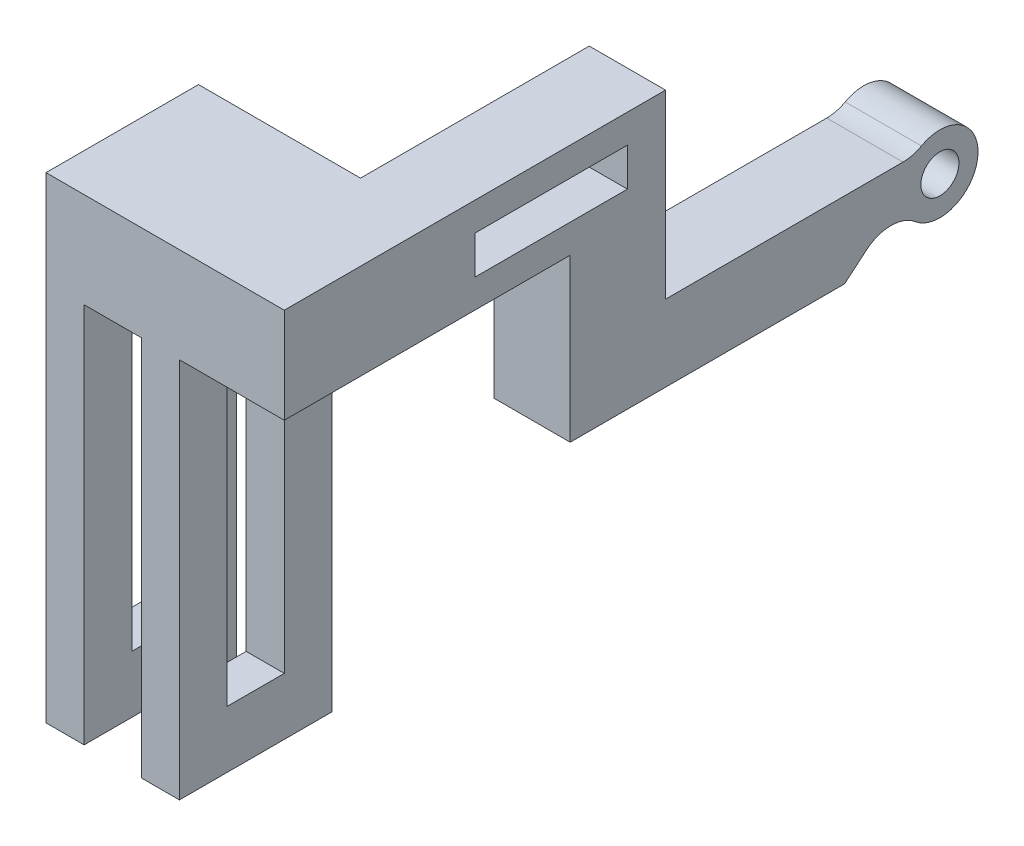
ISO-10303-21;
HEADER;
FILE_DESCRIPTION(('STEP AP214'),'2;1');
FILE_NAME('part.step','',(''),(''),'','','');
FILE_SCHEMA(('AUTOMOTIVE_DESIGN { 1 0 10303 214 1 1 1 1 }'));
ENDSEC;
DATA;
#1=APPLICATION_CONTEXT('core data for automotive mechanical design processes');
#2=APPLICATION_PROTOCOL_DEFINITION('international standard','automotive_design',2000,#1);
#3=PRODUCT_CONTEXT('',#1,'mechanical');
#4=PRODUCT('Part','Part','',(#3));
#5=PRODUCT_RELATED_PRODUCT_CATEGORY('part','',(#4));
#6=PRODUCT_DEFINITION_FORMATION('','',#4);
#7=PRODUCT_DEFINITION_CONTEXT('part definition',#1,'design');
#8=PRODUCT_DEFINITION('design','',#6,#7);
#9=PRODUCT_DEFINITION_SHAPE('','',#8);
#10=(LENGTH_UNIT() NAMED_UNIT(*) SI_UNIT(.MILLI.,.METRE.));
#11=(NAMED_UNIT(*) PLANE_ANGLE_UNIT() SI_UNIT($,.RADIAN.));
#12=(NAMED_UNIT(*) SI_UNIT($,.STERADIAN.) SOLID_ANGLE_UNIT());
#13=UNCERTAINTY_MEASURE_WITH_UNIT(LENGTH_MEASURE(1.E-05),#10,'distance_accuracy_value','');
#14=(GEOMETRIC_REPRESENTATION_CONTEXT(3) GLOBAL_UNCERTAINTY_ASSIGNED_CONTEXT((#13)) GLOBAL_UNIT_ASSIGNED_CONTEXT((#10,
#11,#12)) REPRESENTATION_CONTEXT('',''));
#15=CARTESIAN_POINT('',(0.,0.,0.));
#16=DIRECTION('',(0.,0.,1.));
#17=DIRECTION('',(1.,0.,0.));
#18=AXIS2_PLACEMENT_3D('',#15,#16,#17);
#19=CARTESIAN_POINT('',(22.6155281280883,8.82842712474617,0.));
#20=DIRECTION('',(0.,-1.,0.));
#21=DIRECTION('',(0.,0.,-1.));
#22=AXIS2_PLACEMENT_3D('',#19,#20,#21);
#23=PLANE('',#22);
#24=DIRECTION('',(0.,0.,1.));
#25=VECTOR('',#24,1.);
#26=CARTESIAN_POINT('',(-3.5,8.82842712474617,0.));
#27=LINE('',#26,#25);
#28=CARTESIAN_POINT('',(-3.5,8.82842712474617,29.2212425586298));
#29=VERTEX_POINT('',#28);
#30=CARTESIAN_POINT('',(-3.5,8.82842712474617,31.7212425586298));
#31=VERTEX_POINT('',#30);
#32=EDGE_CURVE('E268',#29,#31,#27,.T.);
#33=ORIENTED_EDGE('',*,*,#32,.F.);
#34=DIRECTION('',(1.,0.,0.));
#35=VECTOR('',#34,1.);
#36=CARTESIAN_POINT('',(-10.5,8.82842712474617,29.2212425586298));
#37=LINE('',#36,#35);
#38=CARTESIAN_POINT('',(-2.,8.82842712474617,29.2212425586298));
#39=VERTEX_POINT('',#38);
#40=EDGE_CURVE('E364',#29,#39,#37,.T.);
#41=ORIENTED_EDGE('',*,*,#40,.T.);
#42=DIRECTION('',(0.,0.,-1.));
#43=VECTOR('',#42,1.);
#44=CARTESIAN_POINT('',(-2.,8.82842712474617,0.));
#45=LINE('',#44,#43);
#46=CARTESIAN_POINT('',(-2.,8.82842712474617,22.2212425586298));
#47=VERTEX_POINT('',#46);
#48=EDGE_CURVE('E370',#39,#47,#45,.T.);
#49=ORIENTED_EDGE('',*,*,#48,.T.);
#50=DIRECTION('',(-1.,0.,0.));
#51=VECTOR('',#50,1.);
#52=CARTESIAN_POINT('',(22.6155281280883,8.82842712474617,22.2212425586298));
#53=LINE('',#52,#51);
#54=CARTESIAN_POINT('',(2.,8.82842712474617,22.2212425586298));
#55=VERTEX_POINT('',#54);
#56=EDGE_CURVE('E373',#55,#47,#53,.T.);
#57=ORIENTED_EDGE('',*,*,#56,.F.);
#58=DIRECTION('',(0.,0.,1.));
#59=VECTOR('',#58,1.);
#60=CARTESIAN_POINT('',(2.,8.82842712474617,0.));
#61=LINE('',#60,#59);
#62=CARTESIAN_POINT('',(2.,8.82842712474617,37.2212425586298));
#63=VERTEX_POINT('',#62);
#64=EDGE_CURVE('E376',#55,#63,#61,.T.);
#65=ORIENTED_EDGE('',*,*,#64,.T.);
#66=DIRECTION('',(-1.,0.,0.));
#67=VECTOR('',#66,1.);
#68=CARTESIAN_POINT('',(22.6155281280883,8.82842712474617,37.2212425586298));
#69=LINE('',#68,#67);
#70=CARTESIAN_POINT('',(-3.5,8.82842712474617,37.2212425586298));
#71=VERTEX_POINT('',#70);
#72=EDGE_CURVE('E386',#63,#71,#69,.T.);
#73=ORIENTED_EDGE('',*,*,#72,.T.);
#74=CARTESIAN_POINT('',(-3.5,8.82842712474617,34.7212425586298));
#75=VERTEX_POINT('',#74);
#76=EDGE_CURVE('E250',#75,#71,#27,.T.);
#77=ORIENTED_EDGE('',*,*,#76,.F.);
#78=DIRECTION('',(-1.,0.,0.));
#79=VECTOR('',#78,1.);
#80=CARTESIAN_POINT('',(-3.5,8.82842712474617,34.7212425586298));
#81=LINE('',#80,#79);
#82=CARTESIAN_POINT('',(-5.5,8.82842712474617,34.7212425586298));
#83=VERTEX_POINT('',#82);
#84=EDGE_CURVE('E262',#75,#83,#81,.T.);
#85=ORIENTED_EDGE('',*,*,#84,.T.);
#86=DIRECTION('',(0.,0.,1.));
#87=VECTOR('',#86,1.);
#88=CARTESIAN_POINT('',(-5.5,8.82842712474617,0.));
#89=LINE('',#88,#87);
#90=CARTESIAN_POINT('',(-5.5,8.82842712474617,37.2212425586298));
#91=VERTEX_POINT('',#90);
#92=EDGE_CURVE('E280',#83,#91,#89,.T.);
#93=ORIENTED_EDGE('',*,*,#92,.T.);
#94=CARTESIAN_POINT('',(-8.5,8.82842712474617,37.2212425586298));
#95=VERTEX_POINT('',#94);
#96=EDGE_CURVE('E379',#91,#95,#69,.T.);
#97=ORIENTED_EDGE('',*,*,#96,.T.);
#98=DIRECTION('',(0.,0.,1.));
#99=VECTOR('',#98,1.);
#100=CARTESIAN_POINT('',(-8.5,8.82842712474617,0.));
#101=LINE('',#100,#99);
#102=CARTESIAN_POINT('',(-8.5,8.82842712474617,34.7212425586298));
#103=VERTEX_POINT('',#102);
#104=EDGE_CURVE('E312',#103,#95,#101,.T.);
#105=ORIENTED_EDGE('',*,*,#104,.F.);
#106=DIRECTION('',(-1.,0.,0.));
#107=VECTOR('',#106,1.);
#108=CARTESIAN_POINT('',(-8.5,8.82842712474617,34.7212425586298));
#109=LINE('',#108,#107);
#110=CARTESIAN_POINT('',(-10.5,8.82842712474617,34.7212425586298));
#111=VERTEX_POINT('',#110);
#112=EDGE_CURVE('E343',#103,#111,#109,.T.);
#113=ORIENTED_EDGE('',*,*,#112,.T.);
#114=DIRECTION('',(0.,0.,1.));
#115=VECTOR('',#114,1.);
#116=CARTESIAN_POINT('',(-10.5,8.82842712474617,0.));
#117=LINE('',#116,#115);
#118=CARTESIAN_POINT('',(-10.5,8.82842712474617,31.7212425586298));
#119=VERTEX_POINT('',#118);
#120=EDGE_CURVE('E357',#119,#111,#117,.T.);
#121=ORIENTED_EDGE('',*,*,#120,.F.);
#122=DIRECTION('',(-1.,0.,0.));
#123=VECTOR('',#122,1.);
#124=CARTESIAN_POINT('',(-8.5,8.82842712474617,31.7212425586298));
#125=LINE('',#124,#123);
#126=CARTESIAN_POINT('',(-8.5,8.82842712474617,31.7212425586298));
#127=VERTEX_POINT('',#126);
#128=EDGE_CURVE('E334',#127,#119,#125,.T.);
#129=ORIENTED_EDGE('',*,*,#128,.F.);
#130=DIRECTION('',(0.,0.,1.));
#131=VECTOR('',#130,1.);
#132=CARTESIAN_POINT('',(-8.5,8.82842712474617,0.));
#133=LINE('',#132,#131);
#134=CARTESIAN_POINT('',(-8.5,8.82842712474617,29.2212425586298));
#135=VERTEX_POINT('',#134);
#136=EDGE_CURVE('E322',#135,#127,#133,.T.);
#137=ORIENTED_EDGE('',*,*,#136,.F.);
#138=CARTESIAN_POINT('',(-5.5,8.82842712474617,29.2212425586298));
#139=VERTEX_POINT('',#138);
#140=EDGE_CURVE('E361',#135,#139,#37,.T.);
#141=ORIENTED_EDGE('',*,*,#140,.T.);
#142=CARTESIAN_POINT('',(-5.5,8.82842712474617,31.7212425586298));
#143=VERTEX_POINT('',#142);
#144=EDGE_CURVE('E59',#139,#143,#89,.T.);
#145=ORIENTED_EDGE('',*,*,#144,.T.);
#146=DIRECTION('',(-1.,0.,0.));
#147=VECTOR('',#146,1.);
#148=CARTESIAN_POINT('',(-3.5,8.82842712474617,31.7212425586298));
#149=LINE('',#148,#147);
#150=EDGE_CURVE('E54',#31,#143,#149,.T.);
#151=ORIENTED_EDGE('',*,*,#150,.F.);
#152=EDGE_LOOP('',(#33,#41,#49,#57,#65,#73,#77,#85,#93,#97,#105,#113,#121,#129,#137,#141,#145,#151));
#153=FACE_BOUND('',#152,.T.);
#154=ADVANCED_FACE('F39',(#153),#23,.T.);
#155=CARTESIAN_POINT('',(-2.,-0.240042021552196,5.39445461840541));
#156=DIRECTION('',(1.,0.,0.));
#157=DIRECTION('',(0.,0.,-1.));
#158=AXIS2_PLACEMENT_3D('',#155,#156,#157);
#159=PLANE('',#158);
#160=DIRECTION('',(0.,0.,1.));
#161=VECTOR('',#160,1.);
#162=CARTESIAN_POINT('',(-2.,12.3284271247462,27.2212425586298));
#163=LINE('',#162,#161);
#164=CARTESIAN_POINT('',(-2.,12.3284271247462,19.2212425586298));
#165=VERTEX_POINT('',#164);
#166=CARTESIAN_POINT('',(-2.,12.3284271247462,27.2212425586298));
#167=VERTEX_POINT('',#166);
#168=EDGE_CURVE('E404',#165,#167,#163,.T.);
#169=ORIENTED_EDGE('',*,*,#168,.T.);
#170=DIRECTION('',(0.,-1.,0.));
#171=VECTOR('',#170,1.);
#172=CARTESIAN_POINT('',(-2.,10.3284271247462,27.2212425586298));
#173=LINE('',#172,#171);
#174=CARTESIAN_POINT('',(-2.,10.3284271247462,27.2212425586298));
#175=VERTEX_POINT('',#174);
#176=EDGE_CURVE('E400',#167,#175,#173,.T.);
#177=ORIENTED_EDGE('',*,*,#176,.T.);
#178=DIRECTION('',(0.,0.,1.));
#179=VECTOR('',#178,1.);
#180=CARTESIAN_POINT('',(-2.,10.3284271247462,27.2212425586298));
#181=LINE('',#180,#179);
#182=CARTESIAN_POINT('',(-2.,10.3284271247462,19.2212425586298));
#183=VERTEX_POINT('',#182);
#184=EDGE_CURVE('E407',#183,#175,#181,.T.);
#185=ORIENTED_EDGE('',*,*,#184,.F.);
#186=DIRECTION('',(0.,-1.,0.));
#187=VECTOR('',#186,1.);
#188=CARTESIAN_POINT('',(-2.,10.3284271247462,19.2212425586298));
#189=LINE('',#188,#187);
#190=EDGE_CURVE('E369',#165,#183,#189,.T.);
#191=ORIENTED_EDGE('',*,*,#190,.F.);
#192=EDGE_LOOP('',(#169,#177,#185,#191));
#193=FACE_BOUND('',#192,.T.);
#194=CARTESIAN_POINT('',(-2.,2.82842712474617,2.82842712474621));
#195=DIRECTION('',(1.,0.,0.));
#196=DIRECTION('',(0.,0.,-1.));
#197=AXIS2_PLACEMENT_3D('',#194,#195,#196);
#198=CIRCLE('',#197,1.);
#199=CARTESIAN_POINT('',(-2.,2.82842712474617,1.82842712474621));
#200=VERTEX_POINT('',#199);
#201=EDGE_CURVE('E455',#200,#200,#198,.T.);
#202=ORIENTED_EDGE('',*,*,#201,.T.);
#203=EDGE_LOOP('',(#202));
#204=FACE_BOUND('',#203,.T.);
#205=DIRECTION('',(0.,-1.,0.));
#206=VECTOR('',#205,1.);
#207=CARTESIAN_POINT('',(-2.,-0.240042021552196,29.2212425586298));
#208=LINE('',#207,#206);
#209=CARTESIAN_POINT('',(-2.00000000000001,13.8284271247462,29.2212425586298));
#210=VERTEX_POINT('',#209);
#211=EDGE_CURVE('E363',#210,#39,#208,.T.);
#212=ORIENTED_EDGE('',*,*,#211,.F.);
#213=DIRECTION('',(0.,0.,-1.));
#214=VECTOR('',#213,1.);
#215=CARTESIAN_POINT('',(-2.,13.8284271247462,0.));
#216=LINE('',#215,#214);
#217=CARTESIAN_POINT('',(-2.,13.8284271247462,17.2212425586298));
#218=VERTEX_POINT('',#217);
#219=EDGE_CURVE('E372',#210,#218,#216,.T.);
#220=ORIENTED_EDGE('',*,*,#219,.T.);
#221=DIRECTION('',(0.,1.,0.));
#222=VECTOR('',#221,1.);
#223=CARTESIAN_POINT('',(-2.,8.82842712474617,17.2212425586298));
#224=LINE('',#223,#222);
#225=CARTESIAN_POINT('',(-2.,4.32842712474617,17.2212425586298));
#226=VERTEX_POINT('',#225);
#227=EDGE_CURVE('E388',#226,#218,#224,.T.);
#228=ORIENTED_EDGE('',*,*,#227,.F.);
#229=DIRECTION('',(0.,0.,1.));
#230=VECTOR('',#229,1.);
#231=CARTESIAN_POINT('',(-2.,4.32842712474617,4.76491879784991));
#232=LINE('',#231,#230);
#233=CARTESIAN_POINT('',(-2.,4.32842712474617,4.76491879784991));
#234=VERTEX_POINT('',#233);
#235=EDGE_CURVE('E472',#234,#226,#232,.T.);
#236=ORIENTED_EDGE('',*,*,#235,.F.);
#237=CARTESIAN_POINT('',(-2.,6.32842712474617,4.76491879784991));
#238=DIRECTION('',(-1.,0.,0.));
#239=DIRECTION('',(0.,0.,-1.));
#240=AXIS2_PLACEMENT_3D('',#237,#238,#239);
#241=CIRCLE('',#240,2.);
#242=CARTESIAN_POINT('',(-2.,4.57842712474617,3.79667296129806));
#243=VERTEX_POINT('',#242);
#244=EDGE_CURVE('E469',#243,#234,#241,.T.);
#245=ORIENTED_EDGE('',*,*,#244,.F.);
#246=CARTESIAN_POINT('',(-2.,2.82842712474617,2.82842712474621));
#247=DIRECTION('',(1.,0.,0.));
#248=DIRECTION('',(0.,0.,-1.));
#249=AXIS2_PLACEMENT_3D('',#246,#247,#248);
#250=CIRCLE('',#249,2.);
#251=CARTESIAN_POINT('',(-2.,1.29419255159699,4.11144087157581));
#252=VERTEX_POINT('',#251);
#253=EDGE_CURVE('E466',#252,#243,#250,.T.);
#254=ORIENTED_EDGE('',*,*,#253,.F.);
#255=CARTESIAN_POINT('',(-2.,-0.240042021552196,5.39445461840541));
#256=DIRECTION('',(-1.,0.,0.));
#257=DIRECTION('',(0.,0.,-1.));
#258=AXIS2_PLACEMENT_3D('',#255,#256,#257);
#259=CIRCLE('',#258,2.);
#260=CARTESIAN_POINT('',(-2.,1.29204686468577,6.68002983777848));
#261=VERTEX_POINT('',#260);
#262=EDGE_CURVE('E463',#261,#252,#259,.T.);
#263=ORIENTED_EDGE('',*,*,#262,.F.);
#264=DIRECTION('',(0.,0.642787609686535,-0.766044443118982));
#265=VECTOR('',#264,1.);
#266=CARTESIAN_POINT('',(-2.,0.328427124746174,7.8284271247462));
#267=LINE('',#266,#265);
#268=CARTESIAN_POINT('',(-2.,0.328427124746174,7.8284271247462));
#269=VERTEX_POINT('',#268);
#270=EDGE_CURVE('E460',#269,#261,#267,.T.);
#271=ORIENTED_EDGE('',*,*,#270,.F.);
#272=DIRECTION('',(0.,0.,-1.));
#273=VECTOR('',#272,1.);
#274=CARTESIAN_POINT('',(-2.,0.328427124746174,7.8284271247462));
#275=LINE('',#274,#273);
#276=CARTESIAN_POINT('',(-2.,0.328427124746172,22.2212425586298));
#277=VERTEX_POINT('',#276);
#278=EDGE_CURVE('E458',#277,#269,#275,.T.);
#279=ORIENTED_EDGE('',*,*,#278,.F.);
#280=DIRECTION('',(0.,-1.,0.));
#281=VECTOR('',#280,1.);
#282=CARTESIAN_POINT('',(-2.,-0.240042021552196,22.2212425586298));
#283=LINE('',#282,#281);
#284=EDGE_CURVE('E433',#47,#277,#283,.T.);
#285=ORIENTED_EDGE('',*,*,#284,.F.);
#286=ORIENTED_EDGE('',*,*,#48,.F.);
#287=EDGE_LOOP('',(#212,#220,#228,#236,#245,#254,#263,#271,#279,#285,#286));
#288=FACE_BOUND('',#287,.T.);
#289=ADVANCED_FACE('F504',(#193,#204,#288),#159,.F.);
#290=CARTESIAN_POINT('',(-2.,4.32842712474617,4.76491879784991));
#291=DIRECTION('',(0.,1.,0.));
#292=DIRECTION('',(0.,0.,1.));
#293=AXIS2_PLACEMENT_3D('',#290,#291,#292);
#294=PLANE('',#293);
#295=DIRECTION('',(-1.,0.,0.));
#296=VECTOR('',#295,1.);
#297=CARTESIAN_POINT('',(22.6155281280883,4.32842712474617,17.2212425586298));
#298=LINE('',#297,#296);
#299=CARTESIAN_POINT('',(2.,4.32842712474617,17.2212425586298));
#300=VERTEX_POINT('',#299);
#301=EDGE_CURVE('E395',#300,#226,#298,.T.);
#302=ORIENTED_EDGE('',*,*,#301,.F.);
#303=DIRECTION('',(0.,0.,1.));
#304=VECTOR('',#303,1.);
#305=CARTESIAN_POINT('',(2.,4.32842712474617,4.76491879784991));
#306=LINE('',#305,#304);
#307=CARTESIAN_POINT('',(2.,4.32842712474617,4.76491879784991));
#308=VERTEX_POINT('',#307);
#309=EDGE_CURVE('E452',#308,#300,#306,.T.);
#310=ORIENTED_EDGE('',*,*,#309,.F.);
#311=DIRECTION('',(1.,0.,0.));
#312=VECTOR('',#311,1.);
#313=CARTESIAN_POINT('',(-2.,4.32842712474617,4.76491879784991));
#314=LINE('',#313,#312);
#315=EDGE_CURVE('E47',#234,#308,#314,.T.);
#316=ORIENTED_EDGE('',*,*,#315,.F.);
#317=ORIENTED_EDGE('',*,*,#235,.T.);
#318=EDGE_LOOP('',(#302,#310,#316,#317));
#319=FACE_BOUND('',#318,.T.);
#320=ADVANCED_FACE('F512',(#319),#294,.T.);
#321=CARTESIAN_POINT('',(-2.,0.328427124746174,7.8284271247462));
#322=DIRECTION('',(0.,-1.,0.));
#323=DIRECTION('',(0.,0.,-1.));
#324=AXIS2_PLACEMENT_3D('',#321,#322,#323);
#325=PLANE('',#324);
#326=DIRECTION('',(0.,0.,-1.));
#327=VECTOR('',#326,1.);
#328=CARTESIAN_POINT('',(2.,0.328427124746174,7.8284271247462));
#329=LINE('',#328,#327);
#330=CARTESIAN_POINT('',(2.,0.328427124746172,22.2212425586298));
#331=VERTEX_POINT('',#330);
#332=CARTESIAN_POINT('',(2.,0.328427124746174,7.8284271247462));
#333=VERTEX_POINT('',#332);
#334=EDGE_CURVE('E438',#331,#333,#329,.T.);
#335=ORIENTED_EDGE('',*,*,#334,.F.);
#336=DIRECTION('',(-1.,0.,0.));
#337=VECTOR('',#336,1.);
#338=CARTESIAN_POINT('',(-2.,0.328427124746172,22.2212425586298));
#339=LINE('',#338,#337);
#340=EDGE_CURVE('E385',#331,#277,#339,.T.);
#341=ORIENTED_EDGE('',*,*,#340,.T.);
#342=ORIENTED_EDGE('',*,*,#278,.T.);
#343=DIRECTION('',(1.,0.,0.));
#344=VECTOR('',#343,1.);
#345=CARTESIAN_POINT('',(-2.,0.328427124746174,7.8284271247462));
#346=LINE('',#345,#344);
#347=EDGE_CURVE('E474',#269,#333,#346,.T.);
#348=ORIENTED_EDGE('',*,*,#347,.T.);
#349=EDGE_LOOP('',(#335,#341,#342,#348));
#350=FACE_BOUND('',#349,.T.);
#351=ADVANCED_FACE('F41',(#350),#325,.T.);
#352=CARTESIAN_POINT('',(2.,-0.240042021552196,5.39445461840541));
#353=DIRECTION('',(1.,0.,0.));
#354=DIRECTION('',(0.,0.,-1.));
#355=AXIS2_PLACEMENT_3D('',#352,#353,#354);
#356=PLANE('',#355);
#357=CARTESIAN_POINT('',(2.,2.82842712474617,2.82842712474621));
#358=DIRECTION('',(1.,0.,0.));
#359=DIRECTION('',(0.,0.,-1.));
#360=AXIS2_PLACEMENT_3D('',#357,#358,#359);
#361=CIRCLE('',#360,1.);
#362=CARTESIAN_POINT('',(2.,2.82842712474617,1.82842712474621));
#363=VERTEX_POINT('',#362);
#364=EDGE_CURVE('E435',#363,#363,#361,.T.);
#365=ORIENTED_EDGE('',*,*,#364,.F.);
#366=EDGE_LOOP('',(#365));
#367=FACE_BOUND('',#366,.T.);
#368=ORIENTED_EDGE('',*,*,#309,.T.);
#369=DIRECTION('',(0.,-1.,0.));
#370=VECTOR('',#369,1.);
#371=CARTESIAN_POINT('',(2.,8.82842712474617,17.2212425586298));
#372=LINE('',#371,#370);
#373=CARTESIAN_POINT('',(2.,13.8284271247462,17.2212425586298));
#374=VERTEX_POINT('',#373);
#375=EDGE_CURVE('E391',#374,#300,#372,.T.);
#376=ORIENTED_EDGE('',*,*,#375,.F.);
#377=DIRECTION('',(0.,0.,1.));
#378=VECTOR('',#377,1.);
#379=CARTESIAN_POINT('',(2.,13.8284271247462,0.));
#380=LINE('',#379,#378);
#381=CARTESIAN_POINT('',(2.,13.8284271247462,37.2212425586298));
#382=VERTEX_POINT('',#381);
#383=EDGE_CURVE('E375',#374,#382,#380,.T.);
#384=ORIENTED_EDGE('',*,*,#383,.T.);
#385=DIRECTION('',(0.,-1.,0.));
#386=VECTOR('',#385,1.);
#387=CARTESIAN_POINT('',(2.,0.,37.2212425586298));
#388=LINE('',#387,#386);
#389=EDGE_CURVE('E380',#382,#63,#388,.T.);
#390=ORIENTED_EDGE('',*,*,#389,.T.);
#391=ORIENTED_EDGE('',*,*,#64,.F.);
#392=DIRECTION('',(0.,-1.,0.));
#393=VECTOR('',#392,1.);
#394=CARTESIAN_POINT('',(2.,-0.240042021552196,22.2212425586298));
#395=LINE('',#394,#393);
#396=EDGE_CURVE('E11',#55,#331,#395,.T.);
#397=ORIENTED_EDGE('',*,*,#396,.T.);
#398=ORIENTED_EDGE('',*,*,#334,.T.);
#399=DIRECTION('',(0.,0.642787609686535,-0.766044443118982));
#400=VECTOR('',#399,1.);
#401=CARTESIAN_POINT('',(2.,0.328427124746174,7.8284271247462));
#402=LINE('',#401,#400);
#403=CARTESIAN_POINT('',(2.,1.29204686468577,6.68002983777848));
#404=VERTEX_POINT('',#403);
#405=EDGE_CURVE('E440',#333,#404,#402,.T.);
#406=ORIENTED_EDGE('',*,*,#405,.T.);
#407=CARTESIAN_POINT('',(2.,-0.240042021552196,5.39445461840541));
#408=DIRECTION('',(-1.,0.,0.));
#409=DIRECTION('',(0.,0.,-1.));
#410=AXIS2_PLACEMENT_3D('',#407,#408,#409);
#411=CIRCLE('',#410,2.);
#412=CARTESIAN_POINT('',(2.,1.29419255159699,4.11144087157581));
#413=VERTEX_POINT('',#412);
#414=EDGE_CURVE('E443',#404,#413,#411,.T.);
#415=ORIENTED_EDGE('',*,*,#414,.T.);
#416=CARTESIAN_POINT('',(2.,2.82842712474617,2.82842712474621));
#417=DIRECTION('',(1.,0.,0.));
#418=DIRECTION('',(0.,0.,-1.));
#419=AXIS2_PLACEMENT_3D('',#416,#417,#418);
#420=CIRCLE('',#419,2.);
#421=CARTESIAN_POINT('',(2.,4.57842712474617,3.79667296129806));
#422=VERTEX_POINT('',#421);
#423=EDGE_CURVE('E446',#413,#422,#420,.T.);
#424=ORIENTED_EDGE('',*,*,#423,.T.);
#425=CARTESIAN_POINT('',(2.,6.32842712474617,4.76491879784991));
#426=DIRECTION('',(-1.,0.,0.));
#427=DIRECTION('',(0.,0.,-1.));
#428=AXIS2_PLACEMENT_3D('',#425,#426,#427);
#429=CIRCLE('',#428,2.);
#430=EDGE_CURVE('E449',#422,#308,#429,.T.);
#431=ORIENTED_EDGE('',*,*,#430,.T.);
#432=EDGE_LOOP('',(#368,#376,#384,#390,#391,#397,#398,#406,#415,#424,#431));
#433=FACE_BOUND('',#432,.T.);
#434=DIRECTION('',(0.,1.,0.));
#435=VECTOR('',#434,1.);
#436=CARTESIAN_POINT('',(2.,10.3284271247462,27.2212425586298));
#437=LINE('',#436,#435);
#438=CARTESIAN_POINT('',(2.,10.3284271247462,27.2212425586298));
#439=VERTEX_POINT('',#438);
#440=CARTESIAN_POINT('',(2.,12.3284271247462,27.2212425586298));
#441=VERTEX_POINT('',#440);
#442=EDGE_CURVE('E414',#439,#441,#437,.T.);
#443=ORIENTED_EDGE('',*,*,#442,.T.);
#444=DIRECTION('',(0.,0.,-1.));
#445=VECTOR('',#444,1.);
#446=CARTESIAN_POINT('',(2.,12.3284271247462,27.2212425586298));
#447=LINE('',#446,#445);
#448=CARTESIAN_POINT('',(2.,12.3284271247462,19.2212425586298));
#449=VERTEX_POINT('',#448);
#450=EDGE_CURVE('E416',#441,#449,#447,.T.);
#451=ORIENTED_EDGE('',*,*,#450,.T.);
#452=DIRECTION('',(0.,1.,0.));
#453=VECTOR('',#452,1.);
#454=CARTESIAN_POINT('',(2.,10.3284271247462,19.2212425586298));
#455=LINE('',#454,#453);
#456=CARTESIAN_POINT('',(2.,10.3284271247462,19.2212425586298));
#457=VERTEX_POINT('',#456);
#458=EDGE_CURVE('E392',#457,#449,#455,.T.);
#459=ORIENTED_EDGE('',*,*,#458,.F.);
#460=DIRECTION('',(0.,0.,-1.));
#461=VECTOR('',#460,1.);
#462=CARTESIAN_POINT('',(2.,10.3284271247462,27.2212425586298));
#463=LINE('',#462,#461);
#464=EDGE_CURVE('E403',#439,#457,#463,.T.);
#465=ORIENTED_EDGE('',*,*,#464,.F.);
#466=EDGE_LOOP('',(#443,#451,#459,#465));
#467=FACE_BOUND('',#466,.T.);
#468=ADVANCED_FACE('F492',(#367,#433,#467),#356,.T.);
#469=CARTESIAN_POINT('',(-2.,6.32842712474617,4.76491879784991));
#470=DIRECTION('',(1.,0.,0.));
#471=DIRECTION('',(0.,0.,-1.));
#472=AXIS2_PLACEMENT_3D('',#469,#470,#471);
#473=CYLINDRICAL_SURFACE('',#472,2.);
#474=ORIENTED_EDGE('',*,*,#315,.T.);
#475=ORIENTED_EDGE('',*,*,#430,.F.);
#476=DIRECTION('',(1.,0.,0.));
#477=VECTOR('',#476,1.);
#478=CARTESIAN_POINT('',(-2.,4.57842712474617,3.79667296129806));
#479=LINE('',#478,#477);
#480=EDGE_CURVE('E476',#243,#422,#479,.T.);
#481=ORIENTED_EDGE('',*,*,#480,.F.);
#482=ORIENTED_EDGE('',*,*,#244,.T.);
#483=EDGE_LOOP('',(#474,#475,#481,#482));
#484=FACE_BOUND('',#483,.T.);
#485=ADVANCED_FACE('F508',(#484),#473,.F.);
#486=CARTESIAN_POINT('',(-2.,2.82842712474617,2.82842712474621));
#487=DIRECTION('',(1.,0.,0.));
#488=DIRECTION('',(0.,0.,-1.));
#489=AXIS2_PLACEMENT_3D('',#486,#487,#488);
#490=CYLINDRICAL_SURFACE('',#489,2.);
#491=ORIENTED_EDGE('',*,*,#480,.T.);
#492=ORIENTED_EDGE('',*,*,#423,.F.);
#493=DIRECTION('',(1.,0.,0.));
#494=VECTOR('',#493,1.);
#495=CARTESIAN_POINT('',(-2.,1.29419255159699,4.11144087157581));
#496=LINE('',#495,#494);
#497=EDGE_CURVE('E478',#252,#413,#496,.T.);
#498=ORIENTED_EDGE('',*,*,#497,.F.);
#499=ORIENTED_EDGE('',*,*,#253,.T.);
#500=EDGE_LOOP('',(#491,#492,#498,#499));
#501=FACE_BOUND('',#500,.T.);
#502=ADVANCED_FACE('F500',(#501),#490,.T.);
#503=CARTESIAN_POINT('',(-2.,-0.240042021552196,5.39445461840541));
#504=DIRECTION('',(1.,0.,0.));
#505=DIRECTION('',(0.,0.,-1.));
#506=AXIS2_PLACEMENT_3D('',#503,#504,#505);
#507=CYLINDRICAL_SURFACE('',#506,2.);
#508=ORIENTED_EDGE('',*,*,#497,.T.);
#509=ORIENTED_EDGE('',*,*,#414,.F.);
#510=DIRECTION('',(1.,0.,0.));
#511=VECTOR('',#510,1.);
#512=CARTESIAN_POINT('',(-2.,1.29204686468577,6.68002983777848));
#513=LINE('',#512,#511);
#514=EDGE_CURVE('E480',#261,#404,#513,.T.);
#515=ORIENTED_EDGE('',*,*,#514,.F.);
#516=ORIENTED_EDGE('',*,*,#262,.T.);
#517=EDGE_LOOP('',(#508,#509,#515,#516));
#518=FACE_BOUND('',#517,.T.);
#519=ADVANCED_FACE('F496',(#518),#507,.F.);
#520=CARTESIAN_POINT('',(-2.,0.328427124746174,7.8284271247462));
#521=DIRECTION('',(0.,-0.766044443118982,-0.642787609686535));
#522=DIRECTION('',(0.,0.642787609686535,-0.766044443118982));
#523=AXIS2_PLACEMENT_3D('',#520,#521,#522);
#524=PLANE('',#523);
#525=ORIENTED_EDGE('',*,*,#514,.T.);
#526=ORIENTED_EDGE('',*,*,#405,.F.);
#527=ORIENTED_EDGE('',*,*,#347,.F.);
#528=ORIENTED_EDGE('',*,*,#270,.T.);
#529=EDGE_LOOP('',(#525,#526,#527,#528));
#530=FACE_BOUND('',#529,.T.);
#531=ADVANCED_FACE('F489',(#530),#524,.T.);
#532=CARTESIAN_POINT('',(-2.,2.82842712474617,2.82842712474621));
#533=DIRECTION('',(1.,0.,0.));
#534=DIRECTION('',(0.,0.,-1.));
#535=AXIS2_PLACEMENT_3D('',#532,#533,#534);
#536=CYLINDRICAL_SURFACE('',#535,1.);
#537=ORIENTED_EDGE('',*,*,#201,.F.);
#538=EDGE_LOOP('',(#537));
#539=FACE_BOUND('',#538,.T.);
#540=ORIENTED_EDGE('',*,*,#364,.T.);
#541=EDGE_LOOP('',(#540));
#542=FACE_BOUND('',#541,.T.);
#543=ADVANCED_FACE('F618',(#539,#542),#536,.F.);
#544=CARTESIAN_POINT('',(0.,0.,22.2212425586298));
#545=DIRECTION('',(0.,0.,1.));
#546=DIRECTION('',(1.,0.,0.));
#547=AXIS2_PLACEMENT_3D('',#544,#545,#546);
#548=PLANE('',#547);
#549=ORIENTED_EDGE('',*,*,#284,.T.);
#550=ORIENTED_EDGE('',*,*,#340,.F.);
#551=ORIENTED_EDGE('',*,*,#396,.F.);
#552=ORIENTED_EDGE('',*,*,#56,.T.);
#553=EDGE_LOOP('',(#549,#550,#551,#552));
#554=FACE_BOUND('',#553,.T.);
#555=ADVANCED_FACE('F527',(#554),#548,.T.);
#556=CARTESIAN_POINT('',(22.6155281280883,0.,37.2212425586298));
#557=DIRECTION('',(0.,0.,-1.));
#558=DIRECTION('',(-1.,0.,0.));
#559=AXIS2_PLACEMENT_3D('',#556,#557,#558);
#560=PLANE('',#559);
#561=DIRECTION('',(-1.,0.,0.));
#562=VECTOR('',#561,1.);
#563=CARTESIAN_POINT('',(22.6155281280883,13.8284271247462,37.2212425586298));
#564=LINE('',#563,#562);
#565=CARTESIAN_POINT('',(-10.5,13.8284271247462,37.2212425586298));
#566=VERTEX_POINT('',#565);
#567=EDGE_CURVE('E383',#382,#566,#564,.T.);
#568=ORIENTED_EDGE('',*,*,#567,.T.);
#569=DIRECTION('',(0.,-1.,0.));
#570=VECTOR('',#569,1.);
#571=CARTESIAN_POINT('',(-10.5,0.,37.2212425586298));
#572=LINE('',#571,#570);
#573=CARTESIAN_POINT('',(-10.5,-11.1715728752538,37.2212425586298));
#574=VERTEX_POINT('',#573);
#575=EDGE_CURVE('E355',#566,#574,#572,.T.);
#576=ORIENTED_EDGE('',*,*,#575,.T.);
#577=DIRECTION('',(-1.,0.,0.));
#578=VECTOR('',#577,1.);
#579=CARTESIAN_POINT('',(-8.5,-11.1715728752538,37.2212425586298));
#580=LINE('',#579,#578);
#581=CARTESIAN_POINT('',(-8.5,-11.1715728752538,37.2212425586298));
#582=VERTEX_POINT('',#581);
#583=EDGE_CURVE('E346',#582,#574,#580,.T.);
#584=ORIENTED_EDGE('',*,*,#583,.F.);
#585=DIRECTION('',(0.,-1.,0.));
#586=VECTOR('',#585,1.);
#587=CARTESIAN_POINT('',(-8.5,0.,37.2212425586298));
#588=LINE('',#587,#586);
#589=EDGE_CURVE('E310',#95,#582,#588,.T.);
#590=ORIENTED_EDGE('',*,*,#589,.F.);
#591=ORIENTED_EDGE('',*,*,#96,.F.);
#592=DIRECTION('',(0.,-1.,0.));
#593=VECTOR('',#592,1.);
#594=CARTESIAN_POINT('',(-5.5,0.,37.2212425586298));
#595=LINE('',#594,#593);
#596=CARTESIAN_POINT('',(-5.5,-11.1715728752538,37.2212425586298));
#597=VERTEX_POINT('',#596);
#598=EDGE_CURVE('E258',#91,#597,#595,.T.);
#599=ORIENTED_EDGE('',*,*,#598,.T.);
#600=DIRECTION('',(-1.,0.,0.));
#601=VECTOR('',#600,1.);
#602=CARTESIAN_POINT('',(-3.5,-11.1715728752538,37.2212425586298));
#603=LINE('',#602,#601);
#604=CARTESIAN_POINT('',(-3.5,-11.1715728752538,37.2212425586298));
#605=VERTEX_POINT('',#604);
#606=EDGE_CURVE('E255',#605,#597,#603,.T.);
#607=ORIENTED_EDGE('',*,*,#606,.F.);
#608=DIRECTION('',(0.,-1.,0.));
#609=VECTOR('',#608,1.);
#610=CARTESIAN_POINT('',(-3.5,0.,37.2212425586298));
#611=LINE('',#610,#609);
#612=EDGE_CURVE('E242',#71,#605,#611,.T.);
#613=ORIENTED_EDGE('',*,*,#612,.F.);
#614=ORIENTED_EDGE('',*,*,#72,.F.);
#615=ORIENTED_EDGE('',*,*,#389,.F.);
#616=EDGE_LOOP('',(#568,#576,#584,#590,#591,#599,#607,#613,#614,#615));
#617=FACE_BOUND('',#616,.T.);
#618=ADVANCED_FACE('F256',(#617),#560,.F.);
#619=CARTESIAN_POINT('',(22.6155281280883,13.8284271247462,0.));
#620=DIRECTION('',(0.,-1.,0.));
#621=DIRECTION('',(0.,0.,-1.));
#622=AXIS2_PLACEMENT_3D('',#619,#620,#621);
#623=PLANE('',#622);
#624=ORIENTED_EDGE('',*,*,#219,.F.);
#625=DIRECTION('',(1.,0.,0.));
#626=VECTOR('',#625,1.);
#627=CARTESIAN_POINT('',(-10.5,13.8284271247462,29.2212425586298));
#628=LINE('',#627,#626);
#629=CARTESIAN_POINT('',(-10.5,13.8284271247462,29.2212425586298));
#630=VERTEX_POINT('',#629);
#631=EDGE_CURVE('E360',#630,#210,#628,.T.);
#632=ORIENTED_EDGE('',*,*,#631,.F.);
#633=DIRECTION('',(0.,0.,1.));
#634=VECTOR('',#633,1.);
#635=CARTESIAN_POINT('',(-10.5,13.8284271247462,0.));
#636=LINE('',#635,#634);
#637=EDGE_CURVE('E352',#630,#566,#636,.T.);
#638=ORIENTED_EDGE('',*,*,#637,.T.);
#639=ORIENTED_EDGE('',*,*,#567,.F.);
#640=ORIENTED_EDGE('',*,*,#383,.F.);
#641=DIRECTION('',(-1.,0.,0.));
#642=VECTOR('',#641,1.);
#643=CARTESIAN_POINT('',(22.6155281280883,13.8284271247462,17.2212425586298));
#644=LINE('',#643,#642);
#645=EDGE_CURVE('E421',#374,#218,#644,.T.);
#646=ORIENTED_EDGE('',*,*,#645,.T.);
#647=EDGE_LOOP('',(#624,#632,#638,#639,#640,#646));
#648=FACE_BOUND('',#647,.T.);
#649=ADVANCED_FACE('F518',(#648),#623,.F.);
#650=CARTESIAN_POINT('',(22.6155281280883,8.82842712474617,17.2212425586298));
#651=DIRECTION('',(0.,0.,-1.));
#652=DIRECTION('',(-1.,0.,0.));
#653=AXIS2_PLACEMENT_3D('',#650,#651,#652);
#654=PLANE('',#653);
#655=ORIENTED_EDGE('',*,*,#227,.T.);
#656=ORIENTED_EDGE('',*,*,#645,.F.);
#657=ORIENTED_EDGE('',*,*,#375,.T.);
#658=ORIENTED_EDGE('',*,*,#301,.T.);
#659=EDGE_LOOP('',(#655,#656,#657,#658));
#660=FACE_BOUND('',#659,.T.);
#661=ADVANCED_FACE('F514',(#660),#654,.T.);
#662=CARTESIAN_POINT('',(22.6155281280883,10.3284271247462,19.2212425586298));
#663=DIRECTION('',(0.,0.,1.));
#664=DIRECTION('',(1.,0.,0.));
#665=AXIS2_PLACEMENT_3D('',#662,#663,#664);
#666=PLANE('',#665);
#667=DIRECTION('',(-1.,0.,0.));
#668=VECTOR('',#667,1.);
#669=CARTESIAN_POINT('',(22.6155281280883,10.3284271247462,19.2212425586298));
#670=LINE('',#669,#668);
#671=EDGE_CURVE('E424',#457,#183,#670,.T.);
#672=ORIENTED_EDGE('',*,*,#671,.F.);
#673=ORIENTED_EDGE('',*,*,#458,.T.);
#674=DIRECTION('',(-1.,0.,0.));
#675=VECTOR('',#674,1.);
#676=CARTESIAN_POINT('',(22.6155281280883,12.3284271247462,19.2212425586298));
#677=LINE('',#676,#675);
#678=EDGE_CURVE('E418',#449,#165,#677,.T.);
#679=ORIENTED_EDGE('',*,*,#678,.T.);
#680=ORIENTED_EDGE('',*,*,#190,.T.);
#681=EDGE_LOOP('',(#672,#673,#679,#680));
#682=FACE_BOUND('',#681,.T.);
#683=ADVANCED_FACE('F600',(#682),#666,.T.);
#684=CARTESIAN_POINT('',(22.6155281280883,10.3284271247462,27.2212425586298));
#685=DIRECTION('',(0.,1.,0.));
#686=DIRECTION('',(0.,0.,1.));
#687=AXIS2_PLACEMENT_3D('',#684,#685,#686);
#688=PLANE('',#687);
#689=DIRECTION('',(-1.,0.,0.));
#690=VECTOR('',#689,1.);
#691=CARTESIAN_POINT('',(22.6155281280883,10.3284271247462,27.2212425586298));
#692=LINE('',#691,#690);
#693=EDGE_CURVE('E422',#439,#175,#692,.T.);
#694=ORIENTED_EDGE('',*,*,#693,.F.);
#695=ORIENTED_EDGE('',*,*,#464,.T.);
#696=ORIENTED_EDGE('',*,*,#671,.T.);
#697=ORIENTED_EDGE('',*,*,#184,.T.);
#698=EDGE_LOOP('',(#694,#695,#696,#697));
#699=FACE_BOUND('',#698,.T.);
#700=ADVANCED_FACE('F605',(#699),#688,.T.);
#701=CARTESIAN_POINT('',(22.6155281280883,10.3284271247462,27.2212425586298));
#702=DIRECTION('',(0.,0.,1.));
#703=DIRECTION('',(1.,0.,0.));
#704=AXIS2_PLACEMENT_3D('',#701,#702,#703);
#705=PLANE('',#704);
#706=ORIENTED_EDGE('',*,*,#442,.F.);
#707=ORIENTED_EDGE('',*,*,#693,.T.);
#708=ORIENTED_EDGE('',*,*,#176,.F.);
#709=DIRECTION('',(-1.,0.,0.));
#710=VECTOR('',#709,1.);
#711=CARTESIAN_POINT('',(22.6155281280883,12.3284271247462,27.2212425586298));
#712=LINE('',#711,#710);
#713=EDGE_CURVE('E419',#441,#167,#712,.T.);
#714=ORIENTED_EDGE('',*,*,#713,.F.);
#715=EDGE_LOOP('',(#706,#707,#708,#714));
#716=FACE_BOUND('',#715,.T.);
#717=ADVANCED_FACE('F601',(#716),#705,.F.);
#718=CARTESIAN_POINT('',(22.6155281280883,12.3284271247462,27.2212425586298));
#719=DIRECTION('',(0.,1.,0.));
#720=DIRECTION('',(0.,0.,1.));
#721=AXIS2_PLACEMENT_3D('',#718,#719,#720);
#722=PLANE('',#721);
#723=ORIENTED_EDGE('',*,*,#450,.F.);
#724=ORIENTED_EDGE('',*,*,#713,.T.);
#725=ORIENTED_EDGE('',*,*,#168,.F.);
#726=ORIENTED_EDGE('',*,*,#678,.F.);
#727=EDGE_LOOP('',(#723,#724,#725,#726));
#728=FACE_BOUND('',#727,.T.);
#729=ADVANCED_FACE('F604',(#728),#722,.F.);
#730=CARTESIAN_POINT('',(-10.5,0.,29.2212425586298));
#731=DIRECTION('',(0.,0.,1.));
#732=DIRECTION('',(1.,0.,0.));
#733=AXIS2_PLACEMENT_3D('',#730,#731,#732);
#734=PLANE('',#733);
#735=ORIENTED_EDGE('',*,*,#631,.T.);
#736=ORIENTED_EDGE('',*,*,#211,.T.);
#737=ORIENTED_EDGE('',*,*,#40,.F.);
#738=DIRECTION('',(0.,-1.,0.));
#739=VECTOR('',#738,1.);
#740=CARTESIAN_POINT('',(-3.5,0.,29.2212425586298));
#741=LINE('',#740,#739);
#742=CARTESIAN_POINT('',(-3.5,-11.1715728752538,29.2212425586298));
#743=VERTEX_POINT('',#742);
#744=EDGE_CURVE('E266',#29,#743,#741,.T.);
#745=ORIENTED_EDGE('',*,*,#744,.T.);
#746=DIRECTION('',(-1.,0.,0.));
#747=VECTOR('',#746,1.);
#748=CARTESIAN_POINT('',(-3.5,-11.1715728752538,29.2212425586298));
#749=LINE('',#748,#747);
#750=CARTESIAN_POINT('',(-5.5,-11.1715728752538,29.2212425586298));
#751=VERTEX_POINT('',#750);
#752=EDGE_CURVE('E263',#743,#751,#749,.T.);
#753=ORIENTED_EDGE('',*,*,#752,.T.);
#754=DIRECTION('',(0.,-1.,0.));
#755=VECTOR('',#754,1.);
#756=CARTESIAN_POINT('',(-5.5,0.,29.2212425586298));
#757=LINE('',#756,#755);
#758=EDGE_CURVE('E286',#139,#751,#757,.T.);
#759=ORIENTED_EDGE('',*,*,#758,.F.);
#760=ORIENTED_EDGE('',*,*,#140,.F.);
#761=DIRECTION('',(0.,-1.,0.));
#762=VECTOR('',#761,1.);
#763=CARTESIAN_POINT('',(-8.5,0.,29.2212425586298));
#764=LINE('',#763,#762);
#765=CARTESIAN_POINT('',(-8.5,-11.1715728752538,29.2212425586298));
#766=VERTEX_POINT('',#765);
#767=EDGE_CURVE('E303',#135,#766,#764,.T.);
#768=ORIENTED_EDGE('',*,*,#767,.T.);
#769=DIRECTION('',(-1.,0.,0.));
#770=VECTOR('',#769,1.);
#771=CARTESIAN_POINT('',(-8.5,-11.1715728752538,29.2212425586298));
#772=LINE('',#771,#770);
#773=CARTESIAN_POINT('',(-10.5,-11.1715728752538,29.2212425586298));
#774=VERTEX_POINT('',#773);
#775=EDGE_CURVE('E324',#766,#774,#772,.T.);
#776=ORIENTED_EDGE('',*,*,#775,.T.);
#777=DIRECTION('',(0.,-1.,0.));
#778=VECTOR('',#777,1.);
#779=CARTESIAN_POINT('',(-10.5,0.,29.2212425586298));
#780=LINE('',#779,#778);
#781=EDGE_CURVE('E337',#630,#774,#780,.T.);
#782=ORIENTED_EDGE('',*,*,#781,.F.);
#783=EDGE_LOOP('',(#735,#736,#737,#745,#753,#759,#760,#768,#776,#782));
#784=FACE_BOUND('',#783,.T.);
#785=ADVANCED_FACE('F529',(#784),#734,.F.);
#786=CARTESIAN_POINT('',(-10.5,0.,0.));
#787=DIRECTION('',(1.,0.,0.));
#788=DIRECTION('',(0.,0.,-1.));
#789=AXIS2_PLACEMENT_3D('',#786,#787,#788);
#790=PLANE('',#789);
#791=DIRECTION('',(0.,-1.,0.));
#792=VECTOR('',#791,1.);
#793=CARTESIAN_POINT('',(-10.5,0.,31.7212425586298));
#794=LINE('',#793,#792);
#795=CARTESIAN_POINT('',(-10.5,-8.17157287525383,31.7212425586298));
#796=VERTEX_POINT('',#795);
#797=EDGE_CURVE('E307',#119,#796,#794,.T.);
#798=ORIENTED_EDGE('',*,*,#797,.F.);
#799=ORIENTED_EDGE('',*,*,#120,.T.);
#800=DIRECTION('',(0.,-1.,0.));
#801=VECTOR('',#800,1.);
#802=CARTESIAN_POINT('',(-10.5,0.,34.7212425586298));
#803=LINE('',#802,#801);
#804=CARTESIAN_POINT('',(-10.5,-8.17157287525383,34.7212425586298));
#805=VERTEX_POINT('',#804);
#806=EDGE_CURVE('E327',#111,#805,#803,.T.);
#807=ORIENTED_EDGE('',*,*,#806,.T.);
#808=DIRECTION('',(0.,0.,1.));
#809=VECTOR('',#808,1.);
#810=CARTESIAN_POINT('',(-10.5,-8.17157287525383,0.));
#811=LINE('',#810,#809);
#812=EDGE_CURVE('E330',#796,#805,#811,.T.);
#813=ORIENTED_EDGE('',*,*,#812,.F.);
#814=EDGE_LOOP('',(#798,#799,#807,#813));
#815=FACE_BOUND('',#814,.T.);
#816=ORIENTED_EDGE('',*,*,#781,.T.);
#817=DIRECTION('',(0.,0.,1.));
#818=VECTOR('',#817,1.);
#819=CARTESIAN_POINT('',(-10.5,-11.1715728752538,0.));
#820=LINE('',#819,#818);
#821=EDGE_CURVE('E302',#774,#574,#820,.T.);
#822=ORIENTED_EDGE('',*,*,#821,.T.);
#823=ORIENTED_EDGE('',*,*,#575,.F.);
#824=ORIENTED_EDGE('',*,*,#637,.F.);
#825=EDGE_LOOP('',(#816,#822,#823,#824));
#826=FACE_BOUND('',#825,.T.);
#827=ADVANCED_FACE('F534',(#815,#826),#790,.F.);
#828=CARTESIAN_POINT('',(-8.5,0.,31.7212425586298));
#829=DIRECTION('',(0.,0.,-1.));
#830=DIRECTION('',(-1.,0.,0.));
#831=AXIS2_PLACEMENT_3D('',#828,#829,#830);
#832=PLANE('',#831);
#833=ORIENTED_EDGE('',*,*,#797,.T.);
#834=DIRECTION('',(-1.,0.,0.));
#835=VECTOR('',#834,1.);
#836=CARTESIAN_POINT('',(-8.5,-8.17157287525383,31.7212425586298));
#837=LINE('',#836,#835);
#838=CARTESIAN_POINT('',(-8.5,-8.17157287525383,31.7212425586298));
#839=VERTEX_POINT('',#838);
#840=EDGE_CURVE('E338',#839,#796,#837,.T.);
#841=ORIENTED_EDGE('',*,*,#840,.F.);
#842=DIRECTION('',(0.,-1.,0.));
#843=VECTOR('',#842,1.);
#844=CARTESIAN_POINT('',(-8.5,0.,31.7212425586298));
#845=LINE('',#844,#843);
#846=EDGE_CURVE('E320',#127,#839,#845,.T.);
#847=ORIENTED_EDGE('',*,*,#846,.F.);
#848=ORIENTED_EDGE('',*,*,#128,.T.);
#849=EDGE_LOOP('',(#833,#841,#847,#848));
#850=FACE_BOUND('',#849,.T.);
#851=ADVANCED_FACE('F577',(#850),#832,.F.);
#852=CARTESIAN_POINT('',(-8.5,-8.17157287525383,0.));
#853=DIRECTION('',(0.,-1.,0.));
#854=DIRECTION('',(0.,0.,-1.));
#855=AXIS2_PLACEMENT_3D('',#852,#853,#854);
#856=PLANE('',#855);
#857=ORIENTED_EDGE('',*,*,#812,.T.);
#858=DIRECTION('',(-1.,0.,0.));
#859=VECTOR('',#858,1.);
#860=CARTESIAN_POINT('',(-8.5,-8.17157287525383,34.7212425586298));
#861=LINE('',#860,#859);
#862=CARTESIAN_POINT('',(-8.5,-8.17157287525383,34.7212425586298));
#863=VERTEX_POINT('',#862);
#864=EDGE_CURVE('E341',#863,#805,#861,.T.);
#865=ORIENTED_EDGE('',*,*,#864,.F.);
#866=DIRECTION('',(0.,0.,1.));
#867=VECTOR('',#866,1.);
#868=CARTESIAN_POINT('',(-8.5,-8.17157287525383,0.));
#869=LINE('',#868,#867);
#870=EDGE_CURVE('E318',#839,#863,#869,.T.);
#871=ORIENTED_EDGE('',*,*,#870,.F.);
#872=ORIENTED_EDGE('',*,*,#840,.T.);
#873=EDGE_LOOP('',(#857,#865,#871,#872));
#874=FACE_BOUND('',#873,.T.);
#875=ADVANCED_FACE('F579',(#874),#856,.F.);
#876=CARTESIAN_POINT('',(-8.5,0.,34.7212425586298));
#877=DIRECTION('',(0.,0.,-1.));
#878=DIRECTION('',(0.,1.,0.));
#879=AXIS2_PLACEMENT_3D('',#876,#877,#878);
#880=PLANE('',#879);
#881=ORIENTED_EDGE('',*,*,#806,.F.);
#882=ORIENTED_EDGE('',*,*,#112,.F.);
#883=DIRECTION('',(0.,-1.,0.));
#884=VECTOR('',#883,1.);
#885=CARTESIAN_POINT('',(-8.5,0.,34.7212425586298));
#886=LINE('',#885,#884);
#887=EDGE_CURVE('E315',#103,#863,#886,.T.);
#888=ORIENTED_EDGE('',*,*,#887,.T.);
#889=ORIENTED_EDGE('',*,*,#864,.T.);
#890=EDGE_LOOP('',(#881,#882,#888,#889));
#891=FACE_BOUND('',#890,.T.);
#892=ADVANCED_FACE('F570',(#891),#880,.T.);
#893=CARTESIAN_POINT('',(-8.5,-11.1715728752538,0.));
#894=DIRECTION('',(0.,-1.,0.));
#895=DIRECTION('',(0.,0.,-1.));
#896=AXIS2_PLACEMENT_3D('',#893,#894,#895);
#897=PLANE('',#896);
#898=ORIENTED_EDGE('',*,*,#821,.F.);
#899=ORIENTED_EDGE('',*,*,#775,.F.);
#900=DIRECTION('',(0.,0.,1.));
#901=VECTOR('',#900,1.);
#902=CARTESIAN_POINT('',(-8.5,-11.1715728752538,0.));
#903=LINE('',#902,#901);
#904=EDGE_CURVE('E306',#766,#582,#903,.T.);
#905=ORIENTED_EDGE('',*,*,#904,.T.);
#906=ORIENTED_EDGE('',*,*,#583,.T.);
#907=EDGE_LOOP('',(#898,#899,#905,#906));
#908=FACE_BOUND('',#907,.T.);
#909=ADVANCED_FACE('F538',(#908),#897,.T.);
#910=CARTESIAN_POINT('',(-8.5,0.,0.));
#911=DIRECTION('',(-1.,0.,0.));
#912=DIRECTION('',(0.,0.,1.));
#913=AXIS2_PLACEMENT_3D('',#910,#911,#912);
#914=PLANE('',#913);
#915=ORIENTED_EDGE('',*,*,#767,.F.);
#916=ORIENTED_EDGE('',*,*,#136,.T.);
#917=ORIENTED_EDGE('',*,*,#846,.T.);
#918=ORIENTED_EDGE('',*,*,#870,.T.);
#919=ORIENTED_EDGE('',*,*,#887,.F.);
#920=ORIENTED_EDGE('',*,*,#104,.T.);
#921=ORIENTED_EDGE('',*,*,#589,.T.);
#922=ORIENTED_EDGE('',*,*,#904,.F.);
#923=EDGE_LOOP('',(#915,#916,#917,#918,#919,#920,#921,#922));
#924=FACE_BOUND('',#923,.T.);
#925=ADVANCED_FACE('F541',(#924),#914,.F.);
#926=CARTESIAN_POINT('',(-3.5,0.,34.7212425586298));
#927=DIRECTION('',(0.,0.,-1.));
#928=DIRECTION('',(0.,1.,0.));
#929=AXIS2_PLACEMENT_3D('',#926,#927,#928);
#930=PLANE('',#929);
#931=DIRECTION('',(0.,-1.,0.));
#932=VECTOR('',#931,1.);
#933=CARTESIAN_POINT('',(-5.5,0.,34.7212425586298));
#934=LINE('',#933,#932);
#935=CARTESIAN_POINT('',(-5.5,-8.17157287525383,34.7212425586298));
#936=VERTEX_POINT('',#935);
#937=EDGE_CURVE('E277',#83,#936,#934,.T.);
#938=ORIENTED_EDGE('',*,*,#937,.F.);
#939=ORIENTED_EDGE('',*,*,#84,.F.);
#940=DIRECTION('',(0.,-1.,0.));
#941=VECTOR('',#940,1.);
#942=CARTESIAN_POINT('',(-3.5,0.,34.7212425586298));
#943=LINE('',#942,#941);
#944=CARTESIAN_POINT('',(-3.5,-8.17157287525383,34.7212425586298));
#945=VERTEX_POINT('',#944);
#946=EDGE_CURVE('E294',#75,#945,#943,.T.);
#947=ORIENTED_EDGE('',*,*,#946,.T.);
#948=DIRECTION('',(-1.,0.,0.));
#949=VECTOR('',#948,1.);
#950=CARTESIAN_POINT('',(-3.5,-8.17157287525383,34.7212425586298));
#951=LINE('',#950,#949);
#952=EDGE_CURVE('E276',#945,#936,#951,.T.);
#953=ORIENTED_EDGE('',*,*,#952,.T.);
#954=EDGE_LOOP('',(#938,#939,#947,#953));
#955=FACE_BOUND('',#954,.T.);
#956=ADVANCED_FACE('F563',(#955),#930,.T.);
#957=CARTESIAN_POINT('',(-3.5,-11.1715728752538,0.));
#958=DIRECTION('',(0.,-1.,0.));
#959=DIRECTION('',(0.,0.,-1.));
#960=AXIS2_PLACEMENT_3D('',#957,#958,#959);
#961=PLANE('',#960);
#962=DIRECTION('',(0.,0.,1.));
#963=VECTOR('',#962,1.);
#964=CARTESIAN_POINT('',(-5.5,-11.1715728752538,0.));
#965=LINE('',#964,#963);
#966=EDGE_CURVE('E284',#751,#597,#965,.T.);
#967=ORIENTED_EDGE('',*,*,#966,.F.);
#968=ORIENTED_EDGE('',*,*,#752,.F.);
#969=DIRECTION('',(0.,0.,1.));
#970=VECTOR('',#969,1.);
#971=CARTESIAN_POINT('',(-3.5,-11.1715728752538,0.));
#972=LINE('',#971,#970);
#973=EDGE_CURVE('E248',#743,#605,#972,.T.);
#974=ORIENTED_EDGE('',*,*,#973,.T.);
#975=ORIENTED_EDGE('',*,*,#606,.T.);
#976=EDGE_LOOP('',(#967,#968,#974,#975));
#977=FACE_BOUND('',#976,.T.);
#978=ADVANCED_FACE('F265',(#977),#961,.T.);
#979=CARTESIAN_POINT('',(-3.5,0.,31.7212425586298));
#980=DIRECTION('',(0.,0.,-1.));
#981=DIRECTION('',(-1.,0.,0.));
#982=AXIS2_PLACEMENT_3D('',#979,#980,#981);
#983=PLANE('',#982);
#984=DIRECTION('',(0.,-1.,0.));
#985=VECTOR('',#984,1.);
#986=CARTESIAN_POINT('',(-5.5,0.,31.7212425586298));
#987=LINE('',#986,#985);
#988=CARTESIAN_POINT('',(-5.5,-8.17157287525383,31.7212425586298));
#989=VERTEX_POINT('',#988);
#990=EDGE_CURVE('E289',#143,#989,#987,.T.);
#991=ORIENTED_EDGE('',*,*,#990,.T.);
#992=DIRECTION('',(-1.,0.,0.));
#993=VECTOR('',#992,1.);
#994=CARTESIAN_POINT('',(-3.5,-8.17157287525383,31.7212425586298));
#995=LINE('',#994,#993);
#996=CARTESIAN_POINT('',(-3.5,-8.17157287525383,31.7212425586298));
#997=VERTEX_POINT('',#996);
#998=EDGE_CURVE('E296',#997,#989,#995,.T.);
#999=ORIENTED_EDGE('',*,*,#998,.F.);
#1000=DIRECTION('',(0.,-1.,0.));
#1001=VECTOR('',#1000,1.);
#1002=CARTESIAN_POINT('',(-3.5,0.,31.7212425586298));
#1003=LINE('',#1002,#1001);
#1004=EDGE_CURVE('E272',#31,#997,#1003,.T.);
#1005=ORIENTED_EDGE('',*,*,#1004,.F.);
#1006=ORIENTED_EDGE('',*,*,#150,.T.);
#1007=EDGE_LOOP('',(#991,#999,#1005,#1006));
#1008=FACE_BOUND('',#1007,.T.);
#1009=ADVANCED_FACE('F552',(#1008),#983,.F.);
#1010=CARTESIAN_POINT('',(-3.5,-8.17157287525383,0.));
#1011=DIRECTION('',(0.,-1.,0.));
#1012=DIRECTION('',(0.,0.,-1.));
#1013=AXIS2_PLACEMENT_3D('',#1010,#1011,#1012);
#1014=PLANE('',#1013);
#1015=DIRECTION('',(0.,0.,1.));
#1016=VECTOR('',#1015,1.);
#1017=CARTESIAN_POINT('',(-5.5,-8.17157287525383,0.));
#1018=LINE('',#1017,#1016);
#1019=EDGE_CURVE('E291',#989,#936,#1018,.T.);
#1020=ORIENTED_EDGE('',*,*,#1019,.T.);
#1021=ORIENTED_EDGE('',*,*,#952,.F.);
#1022=DIRECTION('',(0.,0.,1.));
#1023=VECTOR('',#1022,1.);
#1024=CARTESIAN_POINT('',(-3.5,-8.17157287525383,0.));
#1025=LINE('',#1024,#1023);
#1026=EDGE_CURVE('E274',#997,#945,#1025,.T.);
#1027=ORIENTED_EDGE('',*,*,#1026,.F.);
#1028=ORIENTED_EDGE('',*,*,#998,.T.);
#1029=EDGE_LOOP('',(#1020,#1021,#1027,#1028));
#1030=FACE_BOUND('',#1029,.T.);
#1031=ADVANCED_FACE('F556',(#1030),#1014,.F.);
#1032=CARTESIAN_POINT('',(-3.5,0.,0.));
#1033=DIRECTION('',(1.,0.,0.));
#1034=DIRECTION('',(0.,0.,-1.));
#1035=AXIS2_PLACEMENT_3D('',#1032,#1033,#1034);
#1036=PLANE('',#1035);
#1037=ORIENTED_EDGE('',*,*,#946,.F.);
#1038=ORIENTED_EDGE('',*,*,#76,.T.);
#1039=ORIENTED_EDGE('',*,*,#612,.T.);
#1040=ORIENTED_EDGE('',*,*,#973,.F.);
#1041=ORIENTED_EDGE('',*,*,#744,.F.);
#1042=ORIENTED_EDGE('',*,*,#32,.T.);
#1043=ORIENTED_EDGE('',*,*,#1004,.T.);
#1044=ORIENTED_EDGE('',*,*,#1026,.T.);
#1045=EDGE_LOOP('',(#1037,#1038,#1039,#1040,#1041,#1042,#1043,#1044));
#1046=FACE_BOUND('',#1045,.T.);
#1047=ADVANCED_FACE('F245',(#1046),#1036,.T.);
#1048=CARTESIAN_POINT('',(-5.5,0.,0.));
#1049=DIRECTION('',(1.,0.,0.));
#1050=DIRECTION('',(0.,0.,-1.));
#1051=AXIS2_PLACEMENT_3D('',#1048,#1049,#1050);
#1052=PLANE('',#1051);
#1053=ORIENTED_EDGE('',*,*,#937,.T.);
#1054=ORIENTED_EDGE('',*,*,#1019,.F.);
#1055=ORIENTED_EDGE('',*,*,#990,.F.);
#1056=ORIENTED_EDGE('',*,*,#144,.F.);
#1057=ORIENTED_EDGE('',*,*,#758,.T.);
#1058=ORIENTED_EDGE('',*,*,#966,.T.);
#1059=ORIENTED_EDGE('',*,*,#598,.F.);
#1060=ORIENTED_EDGE('',*,*,#92,.F.);
#1061=EDGE_LOOP('',(#1053,#1054,#1055,#1056,#1057,#1058,#1059,#1060));
#1062=FACE_BOUND('',#1061,.T.);
#1063=ADVANCED_FACE('F548',(#1062),#1052,.F.);
#1064=CLOSED_SHELL('',(#154,#289,#320,#351,#468,#485,#502,#519,#531,#543,#555,#618,#649,#661,
#683,#700,#717,#729,#785,#827,#851,#875,#892,#909,#925,#956,#978,#1009,#1031,#1047,#1063));
#1065=MANIFOLD_SOLID_BREP('B2',#1064);
#1066=ADVANCED_BREP_SHAPE_REPRESENTATION('',(#18,#1065),#14);
#1067=SHAPE_DEFINITION_REPRESENTATION(#9,#1066);
ENDSEC;
END-ISO-10303-21;
